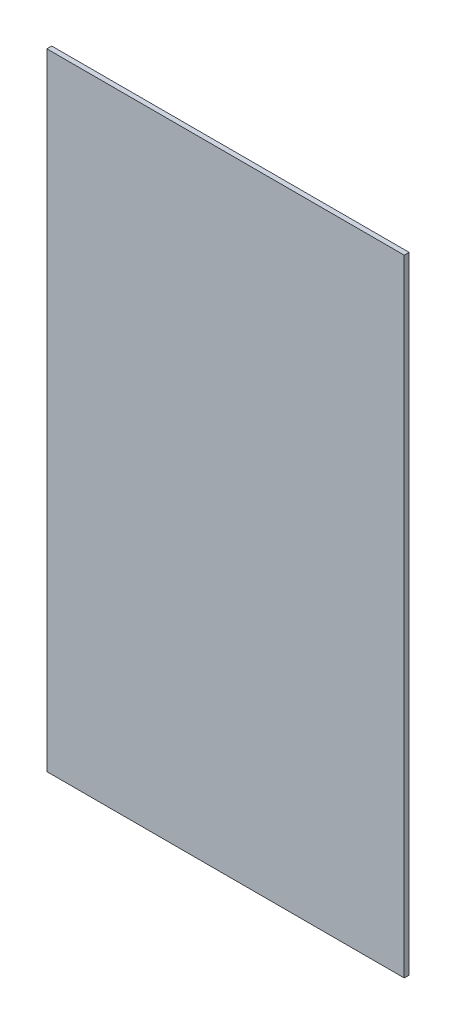
ISO-10303-21;
HEADER;
FILE_DESCRIPTION(('STEP AP214'),'2;1');
FILE_NAME('part.step','',(''),(''),'','','');
FILE_SCHEMA(('AUTOMOTIVE_DESIGN { 1 0 10303 214 1 1 1 1 }'));
ENDSEC;
DATA;
#1=APPLICATION_CONTEXT('core data for automotive mechanical design processes');
#2=APPLICATION_PROTOCOL_DEFINITION('international standard','automotive_design',2000,#1);
#3=PRODUCT_CONTEXT('',#1,'mechanical');
#4=PRODUCT('Part','Part','',(#3));
#5=PRODUCT_RELATED_PRODUCT_CATEGORY('part','',(#4));
#6=PRODUCT_DEFINITION_FORMATION('','',#4);
#7=PRODUCT_DEFINITION_CONTEXT('part definition',#1,'design');
#8=PRODUCT_DEFINITION('design','',#6,#7);
#9=PRODUCT_DEFINITION_SHAPE('','',#8);
#10=(LENGTH_UNIT() NAMED_UNIT(*) SI_UNIT(.MILLI.,.METRE.));
#11=(NAMED_UNIT(*) PLANE_ANGLE_UNIT() SI_UNIT($,.RADIAN.));
#12=(NAMED_UNIT(*) SI_UNIT($,.STERADIAN.) SOLID_ANGLE_UNIT());
#13=UNCERTAINTY_MEASURE_WITH_UNIT(LENGTH_MEASURE(1.E-05),#10,'distance_accuracy_value','');
#14=(GEOMETRIC_REPRESENTATION_CONTEXT(3) GLOBAL_UNCERTAINTY_ASSIGNED_CONTEXT((#13)) GLOBAL_UNIT_ASSIGNED_CONTEXT((#10,
#11,#12)) REPRESENTATION_CONTEXT('',''));
#15=CARTESIAN_POINT('',(0.,0.,0.));
#16=DIRECTION('',(0.,0.,1.));
#17=DIRECTION('',(1.,0.,0.));
#18=AXIS2_PLACEMENT_3D('',#15,#16,#17);
#19=CARTESIAN_POINT('',(237.5,-416.,6.5));
#20=DIRECTION('',(-1.,0.,0.));
#21=DIRECTION('',(0.,0.,1.));
#22=AXIS2_PLACEMENT_3D('',#19,#20,#21);
#23=PLANE('',#22);
#24=DIRECTION('',(0.,1.,0.));
#25=VECTOR('',#24,1.);
#26=CARTESIAN_POINT('',(237.5,-416.,0.));
#27=LINE('',#26,#25);
#28=CARTESIAN_POINT('',(237.5,-416.,0.));
#29=VERTEX_POINT('',#28);
#30=CARTESIAN_POINT('',(237.5,416.,0.));
#31=VERTEX_POINT('',#30);
#32=EDGE_CURVE('E95',#29,#31,#27,.T.);
#33=ORIENTED_EDGE('',*,*,#32,.T.);
#34=DIRECTION('',(0.,0.,-1.));
#35=VECTOR('',#34,1.);
#36=CARTESIAN_POINT('',(237.5,416.,6.5));
#37=LINE('',#36,#35);
#38=CARTESIAN_POINT('',(237.5,416.,6.5));
#39=VERTEX_POINT('',#38);
#40=EDGE_CURVE('E11',#39,#31,#37,.T.);
#41=ORIENTED_EDGE('',*,*,#40,.F.);
#42=DIRECTION('',(0.,1.,0.));
#43=VECTOR('',#42,1.);
#44=CARTESIAN_POINT('',(237.5,-416.,6.5));
#45=LINE('',#44,#43);
#46=CARTESIAN_POINT('',(237.5,-416.,6.5));
#47=VERTEX_POINT('',#46);
#48=EDGE_CURVE('E83',#47,#39,#45,.T.);
#49=ORIENTED_EDGE('',*,*,#48,.F.);
#50=DIRECTION('',(0.,0.,-1.));
#51=VECTOR('',#50,1.);
#52=CARTESIAN_POINT('',(237.5,-416.,6.5));
#53=LINE('',#52,#51);
#54=EDGE_CURVE('E91',#47,#29,#53,.T.);
#55=ORIENTED_EDGE('',*,*,#54,.T.);
#56=EDGE_LOOP('',(#33,#41,#49,#55));
#57=FACE_BOUND('',#56,.T.);
#58=ADVANCED_FACE('F32',(#57),#23,.F.);
#59=CARTESIAN_POINT('',(-237.5,416.,6.5));
#60=DIRECTION('',(0.,-1.,0.));
#61=DIRECTION('',(0.,0.,-1.));
#62=AXIS2_PLACEMENT_3D('',#59,#60,#61);
#63=PLANE('',#62);
#64=DIRECTION('',(-1.,0.,0.));
#65=VECTOR('',#64,1.);
#66=CARTESIAN_POINT('',(-237.5,416.,0.));
#67=LINE('',#66,#65);
#68=CARTESIAN_POINT('',(-237.5,416.,0.));
#69=VERTEX_POINT('',#68);
#70=EDGE_CURVE('E87',#31,#69,#67,.T.);
#71=ORIENTED_EDGE('',*,*,#70,.T.);
#72=DIRECTION('',(0.,0.,-1.));
#73=VECTOR('',#72,1.);
#74=CARTESIAN_POINT('',(-237.5,416.,6.5));
#75=LINE('',#74,#73);
#76=CARTESIAN_POINT('',(-237.5,416.,6.5));
#77=VERTEX_POINT('',#76);
#78=EDGE_CURVE('E40',#77,#69,#75,.T.);
#79=ORIENTED_EDGE('',*,*,#78,.F.);
#80=DIRECTION('',(-1.,0.,0.));
#81=VECTOR('',#80,1.);
#82=CARTESIAN_POINT('',(-237.5,416.,6.5));
#83=LINE('',#82,#81);
#84=EDGE_CURVE('E78',#39,#77,#83,.T.);
#85=ORIENTED_EDGE('',*,*,#84,.F.);
#86=ORIENTED_EDGE('',*,*,#40,.T.);
#87=EDGE_LOOP('',(#71,#79,#85,#86));
#88=FACE_BOUND('',#87,.T.);
#89=ADVANCED_FACE('F86',(#88),#63,.F.);
#90=CARTESIAN_POINT('',(-237.5,-416.,6.5));
#91=DIRECTION('',(1.,0.,0.));
#92=DIRECTION('',(0.,0.,-1.));
#93=AXIS2_PLACEMENT_3D('',#90,#91,#92);
#94=PLANE('',#93);
#95=DIRECTION('',(0.,-1.,0.));
#96=VECTOR('',#95,1.);
#97=CARTESIAN_POINT('',(-237.5,-416.,0.));
#98=LINE('',#97,#96);
#99=CARTESIAN_POINT('',(-237.5,-416.,0.));
#100=VERTEX_POINT('',#99);
#101=EDGE_CURVE('E65',#69,#100,#98,.T.);
#102=ORIENTED_EDGE('',*,*,#101,.T.);
#103=DIRECTION('',(0.,0.,-1.));
#104=VECTOR('',#103,1.);
#105=CARTESIAN_POINT('',(-237.5,-416.,6.5));
#106=LINE('',#105,#104);
#107=CARTESIAN_POINT('',(-237.5,-416.,6.5));
#108=VERTEX_POINT('',#107);
#109=EDGE_CURVE('E88',#108,#100,#106,.T.);
#110=ORIENTED_EDGE('',*,*,#109,.F.);
#111=DIRECTION('',(0.,-1.,0.));
#112=VECTOR('',#111,1.);
#113=CARTESIAN_POINT('',(-237.5,-416.,6.5));
#114=LINE('',#113,#112);
#115=EDGE_CURVE('E81',#77,#108,#114,.T.);
#116=ORIENTED_EDGE('',*,*,#115,.F.);
#117=ORIENTED_EDGE('',*,*,#78,.T.);
#118=EDGE_LOOP('',(#102,#110,#116,#117));
#119=FACE_BOUND('',#118,.T.);
#120=ADVANCED_FACE('F89',(#119),#94,.F.);
#121=CARTESIAN_POINT('',(-237.5,-416.,6.5));
#122=DIRECTION('',(0.,1.,0.));
#123=DIRECTION('',(0.,0.,1.));
#124=AXIS2_PLACEMENT_3D('',#121,#122,#123);
#125=PLANE('',#124);
#126=DIRECTION('',(1.,0.,0.));
#127=VECTOR('',#126,1.);
#128=CARTESIAN_POINT('',(-237.5,-416.,0.));
#129=LINE('',#128,#127);
#130=EDGE_CURVE('E71',#100,#29,#129,.T.);
#131=ORIENTED_EDGE('',*,*,#130,.T.);
#132=ORIENTED_EDGE('',*,*,#54,.F.);
#133=DIRECTION('',(1.,0.,0.));
#134=VECTOR('',#133,1.);
#135=CARTESIAN_POINT('',(-237.5,-416.,6.5));
#136=LINE('',#135,#134);
#137=EDGE_CURVE('E48',#108,#47,#136,.T.);
#138=ORIENTED_EDGE('',*,*,#137,.F.);
#139=ORIENTED_EDGE('',*,*,#109,.T.);
#140=EDGE_LOOP('',(#131,#132,#138,#139));
#141=FACE_BOUND('',#140,.T.);
#142=ADVANCED_FACE('F102',(#141),#125,.F.);
#143=CARTESIAN_POINT('',(0.,0.,6.5));
#144=DIRECTION('',(0.,0.,-1.));
#145=DIRECTION('',(-1.,0.,0.));
#146=AXIS2_PLACEMENT_3D('',#143,#144,#145);
#147=PLANE('',#146);
#148=ORIENTED_EDGE('',*,*,#48,.T.);
#149=ORIENTED_EDGE('',*,*,#84,.T.);
#150=ORIENTED_EDGE('',*,*,#115,.T.);
#151=ORIENTED_EDGE('',*,*,#137,.T.);
#152=EDGE_LOOP('',(#148,#149,#150,#151));
#153=FACE_BOUND('',#152,.T.);
#154=ADVANCED_FACE('F79',(#153),#147,.F.);
#155=CARTESIAN_POINT('',(0.,0.,0.));
#156=DIRECTION('',(0.,0.,-1.));
#157=DIRECTION('',(-1.,0.,0.));
#158=AXIS2_PLACEMENT_3D('',#155,#156,#157);
#159=PLANE('',#158);
#160=ORIENTED_EDGE('',*,*,#32,.F.);
#161=ORIENTED_EDGE('',*,*,#130,.F.);
#162=ORIENTED_EDGE('',*,*,#101,.F.);
#163=ORIENTED_EDGE('',*,*,#70,.F.);
#164=EDGE_LOOP('',(#160,#161,#162,#163));
#165=FACE_BOUND('',#164,.T.);
#166=ADVANCED_FACE('F105',(#165),#159,.T.);
#167=CLOSED_SHELL('',(#58,#89,#120,#142,#154,#166));
#168=MANIFOLD_SOLID_BREP('B2',#167);
#169=ADVANCED_BREP_SHAPE_REPRESENTATION('',(#18,#168),#14);
#170=SHAPE_DEFINITION_REPRESENTATION(#9,#169);
ENDSEC;
END-ISO-10303-21;
